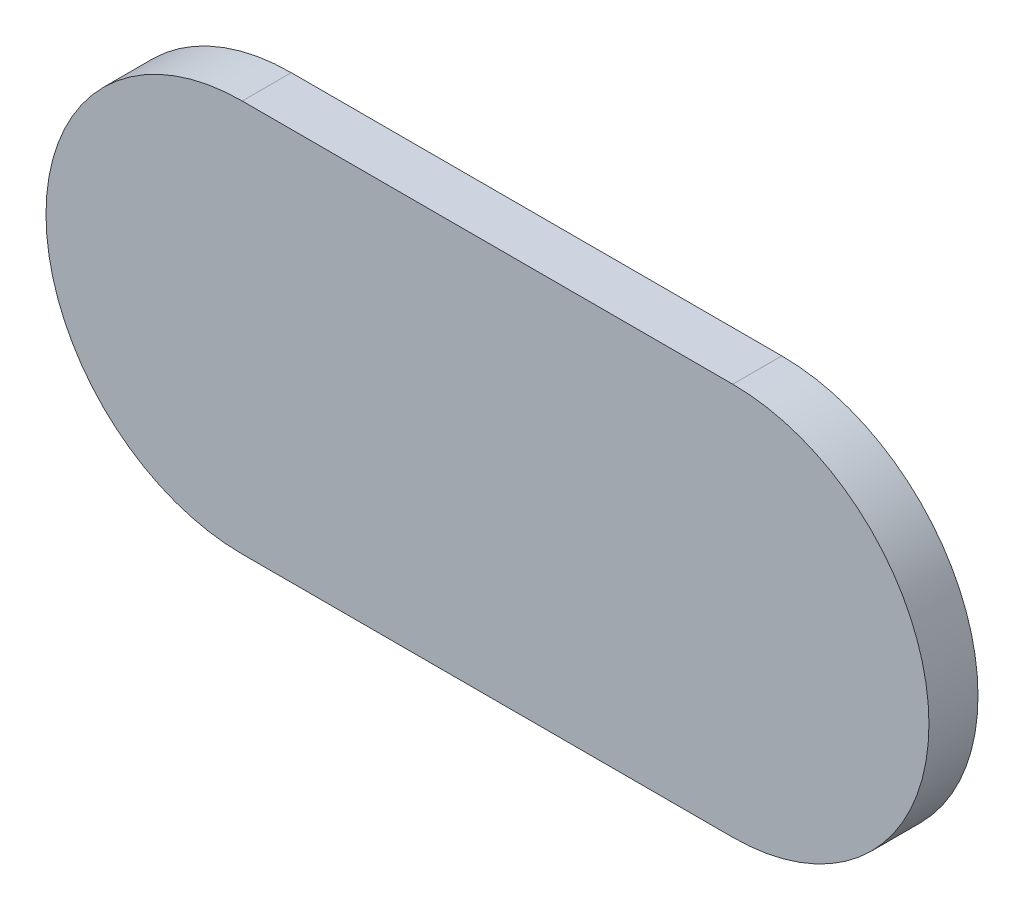
ISO-10303-21;
HEADER;
FILE_DESCRIPTION(('STEP AP214'),'2;1');
FILE_NAME('part.step','',(''),(''),'','','');
FILE_SCHEMA(('AUTOMOTIVE_DESIGN { 1 0 10303 214 1 1 1 1 }'));
ENDSEC;
DATA;
#1=APPLICATION_CONTEXT('core data for automotive mechanical design processes');
#2=APPLICATION_PROTOCOL_DEFINITION('international standard','automotive_design',2000,#1);
#3=PRODUCT_CONTEXT('',#1,'mechanical');
#4=PRODUCT('Part','Part','',(#3));
#5=PRODUCT_RELATED_PRODUCT_CATEGORY('part','',(#4));
#6=PRODUCT_DEFINITION_FORMATION('','',#4);
#7=PRODUCT_DEFINITION_CONTEXT('part definition',#1,'design');
#8=PRODUCT_DEFINITION('design','',#6,#7);
#9=PRODUCT_DEFINITION_SHAPE('','',#8);
#10=(LENGTH_UNIT() NAMED_UNIT(*) SI_UNIT(.MILLI.,.METRE.));
#11=(NAMED_UNIT(*) PLANE_ANGLE_UNIT() SI_UNIT($,.RADIAN.));
#12=(NAMED_UNIT(*) SI_UNIT($,.STERADIAN.) SOLID_ANGLE_UNIT());
#13=UNCERTAINTY_MEASURE_WITH_UNIT(LENGTH_MEASURE(1.E-05),#10,'distance_accuracy_value','');
#14=(GEOMETRIC_REPRESENTATION_CONTEXT(3) GLOBAL_UNCERTAINTY_ASSIGNED_CONTEXT((#13)) GLOBAL_UNIT_ASSIGNED_CONTEXT((#10,
#11,#12)) REPRESENTATION_CONTEXT('',''));
#15=CARTESIAN_POINT('',(0.,0.,0.));
#16=DIRECTION('',(0.,0.,1.));
#17=DIRECTION('',(1.,0.,0.));
#18=AXIS2_PLACEMENT_3D('',#15,#16,#17);
#19=CARTESIAN_POINT('',(0.,0.,10.));
#20=DIRECTION('',(0.,0.,-1.));
#21=DIRECTION('',(-1.,0.,0.));
#22=AXIS2_PLACEMENT_3D('',#19,#20,#21);
#23=CYLINDRICAL_SURFACE('',#22,40.);
#24=CARTESIAN_POINT('',(0.,0.,0.));
#25=DIRECTION('',(0.,0.,1.));
#26=DIRECTION('',(1.,0.,0.));
#27=AXIS2_PLACEMENT_3D('',#24,#25,#26);
#28=CIRCLE('',#27,40.);
#29=CARTESIAN_POINT('',(0.,40.,0.));
#30=VERTEX_POINT('',#29);
#31=CARTESIAN_POINT('',(0.,-40.,0.));
#32=VERTEX_POINT('',#31);
#33=EDGE_CURVE('E96',#30,#32,#28,.T.);
#34=ORIENTED_EDGE('',*,*,#33,.T.);
#35=DIRECTION('',(0.,0.,-1.));
#36=VECTOR('',#35,1.);
#37=CARTESIAN_POINT('',(0.,-40.,10.));
#38=LINE('',#37,#36);
#39=CARTESIAN_POINT('',(0.,-40.,10.));
#40=VERTEX_POINT('',#39);
#41=EDGE_CURVE('E11',#40,#32,#38,.T.);
#42=ORIENTED_EDGE('',*,*,#41,.F.);
#43=CARTESIAN_POINT('',(0.,0.,10.));
#44=DIRECTION('',(0.,0.,1.));
#45=DIRECTION('',(1.,0.,0.));
#46=AXIS2_PLACEMENT_3D('',#43,#44,#45);
#47=CIRCLE('',#46,40.);
#48=CARTESIAN_POINT('',(0.,40.,10.));
#49=VERTEX_POINT('',#48);
#50=EDGE_CURVE('E84',#49,#40,#47,.T.);
#51=ORIENTED_EDGE('',*,*,#50,.F.);
#52=DIRECTION('',(0.,0.,-1.));
#53=VECTOR('',#52,1.);
#54=CARTESIAN_POINT('',(0.,40.,10.));
#55=LINE('',#54,#53);
#56=EDGE_CURVE('E92',#49,#30,#55,.T.);
#57=ORIENTED_EDGE('',*,*,#56,.T.);
#58=EDGE_LOOP('',(#34,#42,#51,#57));
#59=FACE_BOUND('',#58,.T.);
#60=ADVANCED_FACE('F33',(#59),#23,.T.);
#61=CARTESIAN_POINT('',(0.,-40.,10.));
#62=DIRECTION('',(0.,1.,0.));
#63=DIRECTION('',(0.,0.,1.));
#64=AXIS2_PLACEMENT_3D('',#61,#62,#63);
#65=PLANE('',#64);
#66=DIRECTION('',(1.,0.,0.));
#67=VECTOR('',#66,1.);
#68=CARTESIAN_POINT('',(0.,-40.,0.));
#69=LINE('',#68,#67);
#70=CARTESIAN_POINT('',(100.,-40.,0.));
#71=VERTEX_POINT('',#70);
#72=EDGE_CURVE('E88',#32,#71,#69,.T.);
#73=ORIENTED_EDGE('',*,*,#72,.T.);
#74=DIRECTION('',(0.,0.,-1.));
#75=VECTOR('',#74,1.);
#76=CARTESIAN_POINT('',(100.,-40.,10.));
#77=LINE('',#76,#75);
#78=CARTESIAN_POINT('',(100.,-40.,10.));
#79=VERTEX_POINT('',#78);
#80=EDGE_CURVE('E41',#79,#71,#77,.T.);
#81=ORIENTED_EDGE('',*,*,#80,.F.);
#82=DIRECTION('',(1.,0.,0.));
#83=VECTOR('',#82,1.);
#84=CARTESIAN_POINT('',(0.,-40.,10.));
#85=LINE('',#84,#83);
#86=EDGE_CURVE('E79',#40,#79,#85,.T.);
#87=ORIENTED_EDGE('',*,*,#86,.F.);
#88=ORIENTED_EDGE('',*,*,#41,.T.);
#89=EDGE_LOOP('',(#73,#81,#87,#88));
#90=FACE_BOUND('',#89,.T.);
#91=ADVANCED_FACE('F87',(#90),#65,.F.);
#92=CARTESIAN_POINT('',(100.,0.,10.));
#93=DIRECTION('',(0.,0.,-1.));
#94=DIRECTION('',(-1.,0.,0.));
#95=AXIS2_PLACEMENT_3D('',#92,#93,#94);
#96=CYLINDRICAL_SURFACE('',#95,40.);
#97=CARTESIAN_POINT('',(100.,0.,0.));
#98=DIRECTION('',(0.,0.,1.));
#99=DIRECTION('',(1.,0.,0.));
#100=AXIS2_PLACEMENT_3D('',#97,#98,#99);
#101=CIRCLE('',#100,40.);
#102=CARTESIAN_POINT('',(100.,40.,0.));
#103=VERTEX_POINT('',#102);
#104=EDGE_CURVE('E66',#71,#103,#101,.T.);
#105=ORIENTED_EDGE('',*,*,#104,.T.);
#106=DIRECTION('',(0.,0.,-1.));
#107=VECTOR('',#106,1.);
#108=CARTESIAN_POINT('',(100.,40.,10.));
#109=LINE('',#108,#107);
#110=CARTESIAN_POINT('',(100.,40.,10.));
#111=VERTEX_POINT('',#110);
#112=EDGE_CURVE('E89',#111,#103,#109,.T.);
#113=ORIENTED_EDGE('',*,*,#112,.F.);
#114=CARTESIAN_POINT('',(100.,0.,10.));
#115=DIRECTION('',(0.,0.,1.));
#116=DIRECTION('',(1.,0.,0.));
#117=AXIS2_PLACEMENT_3D('',#114,#115,#116);
#118=CIRCLE('',#117,40.);
#119=EDGE_CURVE('E82',#79,#111,#118,.T.);
#120=ORIENTED_EDGE('',*,*,#119,.F.);
#121=ORIENTED_EDGE('',*,*,#80,.T.);
#122=EDGE_LOOP('',(#105,#113,#120,#121));
#123=FACE_BOUND('',#122,.T.);
#124=ADVANCED_FACE('F90',(#123),#96,.T.);
#125=CARTESIAN_POINT('',(0.,40.,10.));
#126=DIRECTION('',(0.,-1.,0.));
#127=DIRECTION('',(0.,0.,-1.));
#128=AXIS2_PLACEMENT_3D('',#125,#126,#127);
#129=PLANE('',#128);
#130=DIRECTION('',(-1.,0.,0.));
#131=VECTOR('',#130,1.);
#132=CARTESIAN_POINT('',(0.,40.,0.));
#133=LINE('',#132,#131);
#134=EDGE_CURVE('E72',#103,#30,#133,.T.);
#135=ORIENTED_EDGE('',*,*,#134,.T.);
#136=ORIENTED_EDGE('',*,*,#56,.F.);
#137=DIRECTION('',(-1.,0.,0.));
#138=VECTOR('',#137,1.);
#139=CARTESIAN_POINT('',(0.,40.,10.));
#140=LINE('',#139,#138);
#141=EDGE_CURVE('E49',#111,#49,#140,.T.);
#142=ORIENTED_EDGE('',*,*,#141,.F.);
#143=ORIENTED_EDGE('',*,*,#112,.T.);
#144=EDGE_LOOP('',(#135,#136,#142,#143));
#145=FACE_BOUND('',#144,.T.);
#146=ADVANCED_FACE('F103',(#145),#129,.F.);
#147=CARTESIAN_POINT('',(0.,0.,10.));
#148=DIRECTION('',(0.,0.,1.));
#149=DIRECTION('',(1.,0.,0.));
#150=AXIS2_PLACEMENT_3D('',#147,#148,#149);
#151=PLANE('',#150);
#152=ORIENTED_EDGE('',*,*,#50,.T.);
#153=ORIENTED_EDGE('',*,*,#86,.T.);
#154=ORIENTED_EDGE('',*,*,#119,.T.);
#155=ORIENTED_EDGE('',*,*,#141,.T.);
#156=EDGE_LOOP('',(#152,#153,#154,#155));
#157=FACE_BOUND('',#156,.T.);
#158=ADVANCED_FACE('F80',(#157),#151,.T.);
#159=CARTESIAN_POINT('',(0.,0.,0.));
#160=DIRECTION('',(0.,0.,1.));
#161=DIRECTION('',(1.,0.,0.));
#162=AXIS2_PLACEMENT_3D('',#159,#160,#161);
#163=PLANE('',#162);
#164=ORIENTED_EDGE('',*,*,#33,.F.);
#165=ORIENTED_EDGE('',*,*,#134,.F.);
#166=ORIENTED_EDGE('',*,*,#104,.F.);
#167=ORIENTED_EDGE('',*,*,#72,.F.);
#168=EDGE_LOOP('',(#164,#165,#166,#167));
#169=FACE_BOUND('',#168,.T.);
#170=ADVANCED_FACE('F106',(#169),#163,.F.);
#171=CLOSED_SHELL('',(#60,#91,#124,#146,#158,#170));
#172=MANIFOLD_SOLID_BREP('B2',#171);
#173=ADVANCED_BREP_SHAPE_REPRESENTATION('',(#18,#172),#14);
#174=SHAPE_DEFINITION_REPRESENTATION(#9,#173);
ENDSEC;
END-ISO-10303-21;
